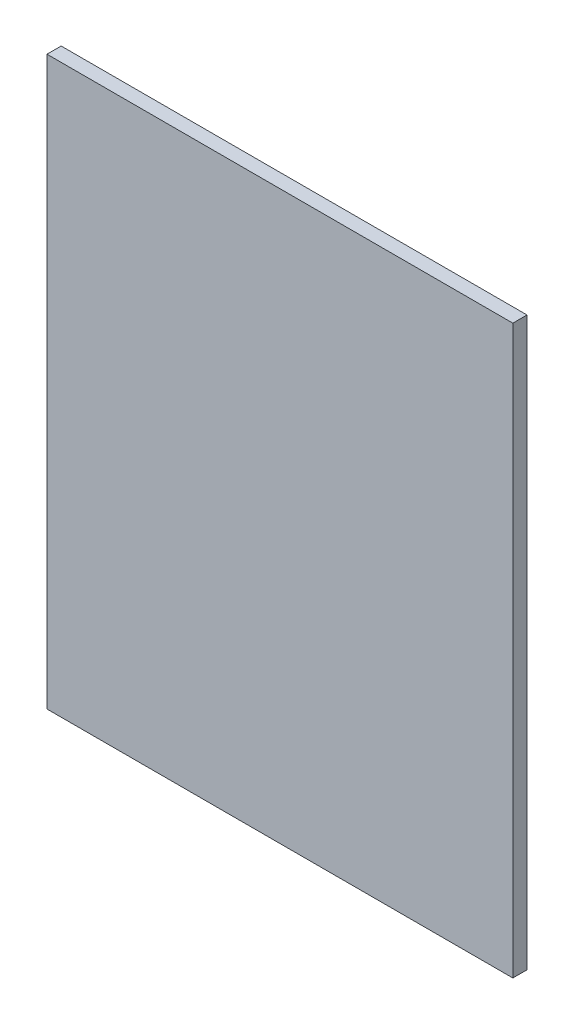
ISO-10303-21;
HEADER;
FILE_DESCRIPTION(('STEP AP214'),'2;1');
FILE_NAME('part.step','',(''),(''),'','','');
FILE_SCHEMA(('AUTOMOTIVE_DESIGN { 1 0 10303 214 1 1 1 1 }'));
ENDSEC;
DATA;
#1=APPLICATION_CONTEXT('core data for automotive mechanical design processes');
#2=APPLICATION_PROTOCOL_DEFINITION('international standard','automotive_design',2000,#1);
#3=PRODUCT_CONTEXT('',#1,'mechanical');
#4=PRODUCT('Part','Part','',(#3));
#5=PRODUCT_RELATED_PRODUCT_CATEGORY('part','',(#4));
#6=PRODUCT_DEFINITION_FORMATION('','',#4);
#7=PRODUCT_DEFINITION_CONTEXT('part definition',#1,'design');
#8=PRODUCT_DEFINITION('design','',#6,#7);
#9=PRODUCT_DEFINITION_SHAPE('','',#8);
#10=(LENGTH_UNIT() NAMED_UNIT(*) SI_UNIT(.MILLI.,.METRE.));
#11=(NAMED_UNIT(*) PLANE_ANGLE_UNIT() SI_UNIT($,.RADIAN.));
#12=(NAMED_UNIT(*) SI_UNIT($,.STERADIAN.) SOLID_ANGLE_UNIT());
#13=UNCERTAINTY_MEASURE_WITH_UNIT(LENGTH_MEASURE(1.E-05),#10,'distance_accuracy_value','');
#14=(GEOMETRIC_REPRESENTATION_CONTEXT(3) GLOBAL_UNCERTAINTY_ASSIGNED_CONTEXT((#13)) GLOBAL_UNIT_ASSIGNED_CONTEXT((#10,
#11,#12)) REPRESENTATION_CONTEXT('',''));
#15=CARTESIAN_POINT('',(0.,0.,0.));
#16=DIRECTION('',(0.,0.,1.));
#17=DIRECTION('',(1.,0.,0.));
#18=AXIS2_PLACEMENT_3D('',#15,#16,#17);
#19=CARTESIAN_POINT('',(88.0275,-112.8375,1.635));
#20=DIRECTION('',(0.,0.,-1.));
#21=DIRECTION('',(0.,-1.,0.));
#22=AXIS2_PLACEMENT_3D('',#19,#20,#21);
#23=PLANE('',#22);
#24=DIRECTION('',(0.,-1.,0.));
#25=VECTOR('',#24,1.);
#26=CARTESIAN_POINT('',(88.6025,-112.1375,1.635));
#27=LINE('',#26,#25);
#28=CARTESIAN_POINT('',(88.6025,-112.1375,1.635));
#29=VERTEX_POINT('',#28);
#30=CARTESIAN_POINT('',(88.6025,-113.5375,1.635));
#31=VERTEX_POINT('',#30);
#32=EDGE_CURVE('E20',#29,#31,#27,.T.);
#33=ORIENTED_EDGE('',*,*,#32,.F.);
#34=DIRECTION('',(1.,0.,0.));
#35=VECTOR('',#34,1.);
#36=CARTESIAN_POINT('',(87.4525,-112.1375,1.635));
#37=LINE('',#36,#35);
#38=CARTESIAN_POINT('',(87.4525,-112.1375,1.635));
#39=VERTEX_POINT('',#38);
#40=EDGE_CURVE('E84',#39,#29,#37,.T.);
#41=ORIENTED_EDGE('',*,*,#40,.F.);
#42=DIRECTION('',(0.,1.,0.));
#43=VECTOR('',#42,1.);
#44=CARTESIAN_POINT('',(87.4525,-113.5375,1.635));
#45=LINE('',#44,#43);
#46=CARTESIAN_POINT('',(87.4525,-113.5375,1.635));
#47=VERTEX_POINT('',#46);
#48=EDGE_CURVE('E87',#47,#39,#45,.T.);
#49=ORIENTED_EDGE('',*,*,#48,.F.);
#50=DIRECTION('',(-1.,0.,0.));
#51=VECTOR('',#50,1.);
#52=CARTESIAN_POINT('',(88.6025,-113.5375,1.635));
#53=LINE('',#52,#51);
#54=EDGE_CURVE('E106',#31,#47,#53,.T.);
#55=ORIENTED_EDGE('',*,*,#54,.F.);
#56=EDGE_LOOP('',(#33,#41,#49,#55));
#57=FACE_BOUND('',#56,.T.);
#58=ADVANCED_FACE('F17',(#57),#23,.F.);
#59=CARTESIAN_POINT('',(88.0275,-112.8375,1.6));
#60=DIRECTION('',(0.,0.,-1.));
#61=DIRECTION('',(0.,-1.,0.));
#62=AXIS2_PLACEMENT_3D('',#59,#60,#61);
#63=PLANE('',#62);
#64=DIRECTION('',(-1.,0.,0.));
#65=VECTOR('',#64,1.);
#66=CARTESIAN_POINT('',(88.6025,-113.5375,1.6));
#67=LINE('',#66,#65);
#68=CARTESIAN_POINT('',(88.6025,-113.5375,1.6));
#69=VERTEX_POINT('',#68);
#70=CARTESIAN_POINT('',(87.4525,-113.5375,1.6));
#71=VERTEX_POINT('',#70);
#72=EDGE_CURVE('E79',#69,#71,#67,.T.);
#73=ORIENTED_EDGE('',*,*,#72,.T.);
#74=DIRECTION('',(0.,1.,0.));
#75=VECTOR('',#74,1.);
#76=CARTESIAN_POINT('',(87.4525,-113.5375,1.6));
#77=LINE('',#76,#75);
#78=CARTESIAN_POINT('',(87.4525,-112.1375,1.6));
#79=VERTEX_POINT('',#78);
#80=EDGE_CURVE('E76',#71,#79,#77,.T.);
#81=ORIENTED_EDGE('',*,*,#80,.T.);
#82=DIRECTION('',(1.,0.,0.));
#83=VECTOR('',#82,1.);
#84=CARTESIAN_POINT('',(87.4525,-112.1375,1.6));
#85=LINE('',#84,#83);
#86=CARTESIAN_POINT('',(88.6025,-112.1375,1.6));
#87=VERTEX_POINT('',#86);
#88=EDGE_CURVE('E65',#79,#87,#85,.T.);
#89=ORIENTED_EDGE('',*,*,#88,.T.);
#90=DIRECTION('',(0.,-1.,0.));
#91=VECTOR('',#90,1.);
#92=CARTESIAN_POINT('',(88.6025,-112.1375,1.6));
#93=LINE('',#92,#91);
#94=EDGE_CURVE('E11',#87,#69,#93,.T.);
#95=ORIENTED_EDGE('',*,*,#94,.T.);
#96=EDGE_LOOP('',(#73,#81,#89,#95));
#97=FACE_BOUND('',#96,.T.);
#98=ADVANCED_FACE('F77',(#97),#63,.T.);
#99=CARTESIAN_POINT('',(88.6025,-112.1375,1.6));
#100=DIRECTION('',(1.,0.,0.));
#101=DIRECTION('',(0.,1.,0.));
#102=AXIS2_PLACEMENT_3D('',#99,#100,#101);
#103=PLANE('',#102);
#104=DIRECTION('',(0.,0.,1.));
#105=VECTOR('',#104,1.);
#106=CARTESIAN_POINT('',(88.6025,-112.1375,1.6));
#107=LINE('',#106,#105);
#108=EDGE_CURVE('E72',#87,#29,#107,.T.);
#109=ORIENTED_EDGE('',*,*,#108,.T.);
#110=ORIENTED_EDGE('',*,*,#32,.T.);
#111=DIRECTION('',(0.,0.,1.));
#112=VECTOR('',#111,1.);
#113=CARTESIAN_POINT('',(88.6025,-113.5375,1.6));
#114=LINE('',#113,#112);
#115=EDGE_CURVE('E148',#69,#31,#114,.T.);
#116=ORIENTED_EDGE('',*,*,#115,.F.);
#117=ORIENTED_EDGE('',*,*,#94,.F.);
#118=EDGE_LOOP('',(#109,#110,#116,#117));
#119=FACE_BOUND('',#118,.T.);
#120=ADVANCED_FACE('F102',(#119),#103,.T.);
#121=CARTESIAN_POINT('',(87.4525,-112.1375,1.6));
#122=DIRECTION('',(0.,1.,0.));
#123=DIRECTION('',(1.,0.,0.));
#124=AXIS2_PLACEMENT_3D('',#121,#122,#123);
#125=PLANE('',#124);
#126=DIRECTION('',(0.,0.,1.));
#127=VECTOR('',#126,1.);
#128=CARTESIAN_POINT('',(87.4525,-112.1375,1.6));
#129=LINE('',#128,#127);
#130=EDGE_CURVE('E70',#79,#39,#129,.T.);
#131=ORIENTED_EDGE('',*,*,#130,.T.);
#132=ORIENTED_EDGE('',*,*,#40,.T.);
#133=ORIENTED_EDGE('',*,*,#108,.F.);
#134=ORIENTED_EDGE('',*,*,#88,.F.);
#135=EDGE_LOOP('',(#131,#132,#133,#134));
#136=FACE_BOUND('',#135,.T.);
#137=ADVANCED_FACE('F67',(#136),#125,.T.);
#138=CARTESIAN_POINT('',(87.4525,-113.5375,1.6));
#139=DIRECTION('',(-1.,0.,0.));
#140=DIRECTION('',(0.,0.,1.));
#141=AXIS2_PLACEMENT_3D('',#138,#139,#140);
#142=PLANE('',#141);
#143=DIRECTION('',(0.,0.,1.));
#144=VECTOR('',#143,1.);
#145=CARTESIAN_POINT('',(87.4525,-113.5375,1.6));
#146=LINE('',#145,#144);
#147=EDGE_CURVE('E135',#71,#47,#146,.T.);
#148=ORIENTED_EDGE('',*,*,#147,.T.);
#149=ORIENTED_EDGE('',*,*,#48,.T.);
#150=ORIENTED_EDGE('',*,*,#130,.F.);
#151=ORIENTED_EDGE('',*,*,#80,.F.);
#152=EDGE_LOOP('',(#148,#149,#150,#151));
#153=FACE_BOUND('',#152,.T.);
#154=ADVANCED_FACE('F86',(#153),#142,.T.);
#155=CARTESIAN_POINT('',(88.6025,-113.5375,1.6));
#156=DIRECTION('',(0.,-1.,0.));
#157=DIRECTION('',(0.,0.,-1.));
#158=AXIS2_PLACEMENT_3D('',#155,#156,#157);
#159=PLANE('',#158);
#160=ORIENTED_EDGE('',*,*,#115,.T.);
#161=ORIENTED_EDGE('',*,*,#54,.T.);
#162=ORIENTED_EDGE('',*,*,#147,.F.);
#163=ORIENTED_EDGE('',*,*,#72,.F.);
#164=EDGE_LOOP('',(#160,#161,#162,#163));
#165=FACE_BOUND('',#164,.T.);
#166=ADVANCED_FACE('F156',(#165),#159,.T.);
#167=CLOSED_SHELL('',(#58,#98,#120,#137,#154,#166));
#168=MANIFOLD_SOLID_BREP('B1',#167);
#169=ADVANCED_BREP_SHAPE_REPRESENTATION('',(#18,#168),#14);
#170=SHAPE_DEFINITION_REPRESENTATION(#9,#169);
ENDSEC;
END-ISO-10303-21;
